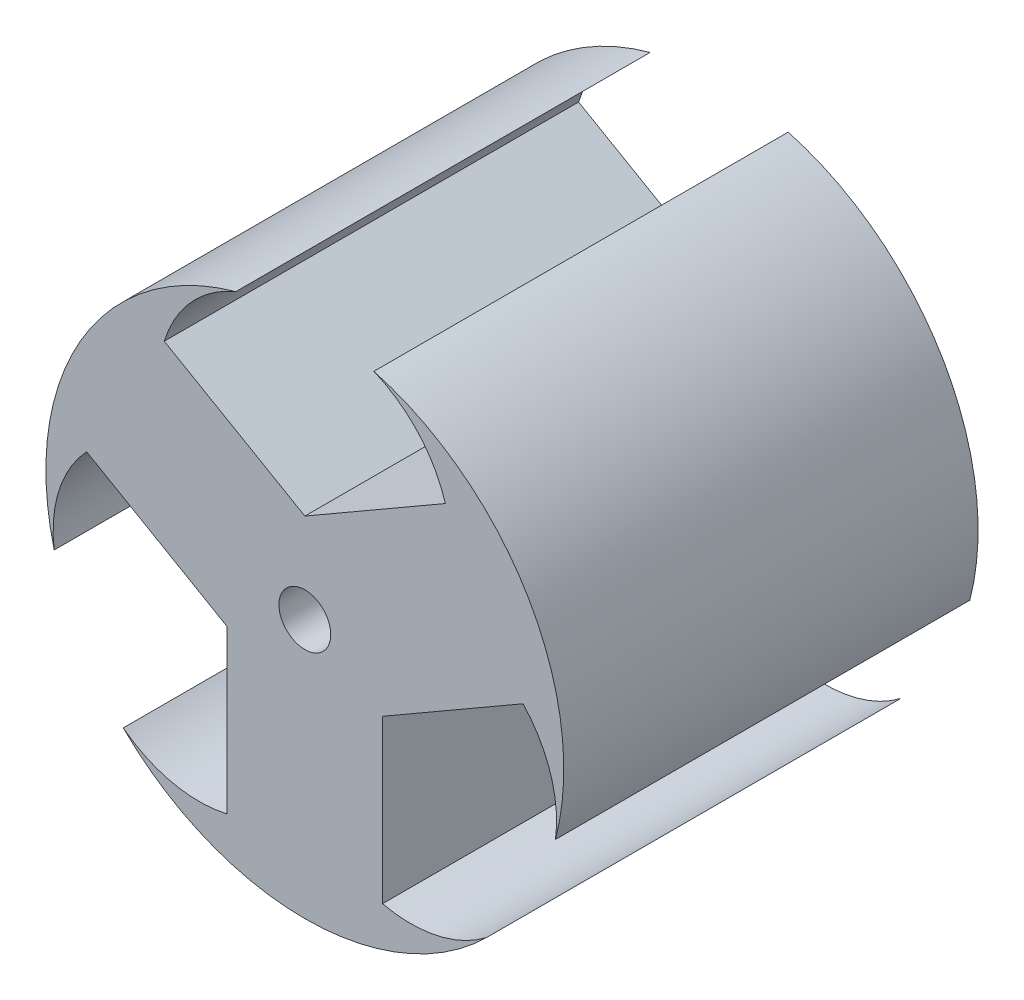
ISO-10303-21;
HEADER;
FILE_DESCRIPTION(('STEP AP214'),'2;1');
FILE_NAME('part.step','',(''),(''),'','','');
FILE_SCHEMA(('AUTOMOTIVE_DESIGN { 1 0 10303 214 1 1 1 1 }'));
ENDSEC;
DATA;
#1=APPLICATION_CONTEXT('core data for automotive mechanical design processes');
#2=APPLICATION_PROTOCOL_DEFINITION('international standard','automotive_design',2000,#1);
#3=PRODUCT_CONTEXT('',#1,'mechanical');
#4=PRODUCT('Part','Part','',(#3));
#5=PRODUCT_RELATED_PRODUCT_CATEGORY('part','',(#4));
#6=PRODUCT_DEFINITION_FORMATION('','',#4);
#7=PRODUCT_DEFINITION_CONTEXT('part definition',#1,'design');
#8=PRODUCT_DEFINITION('design','',#6,#7);
#9=PRODUCT_DEFINITION_SHAPE('','',#8);
#10=(LENGTH_UNIT() NAMED_UNIT(*) SI_UNIT(.MILLI.,.METRE.));
#11=(NAMED_UNIT(*) PLANE_ANGLE_UNIT() SI_UNIT($,.RADIAN.));
#12=(NAMED_UNIT(*) SI_UNIT($,.STERADIAN.) SOLID_ANGLE_UNIT());
#13=UNCERTAINTY_MEASURE_WITH_UNIT(LENGTH_MEASURE(1.E-05),#10,'distance_accuracy_value','');
#14=(GEOMETRIC_REPRESENTATION_CONTEXT(3) GLOBAL_UNCERTAINTY_ASSIGNED_CONTEXT((#13)) GLOBAL_UNIT_ASSIGNED_CONTEXT((#10,
#11,#12)) REPRESENTATION_CONTEXT('',''));
#15=CARTESIAN_POINT('',(0.,0.,0.));
#16=DIRECTION('',(0.,0.,1.));
#17=DIRECTION('',(1.,0.,0.));
#18=AXIS2_PLACEMENT_3D('',#15,#16,#17);
#19=CARTESIAN_POINT('',(-3.74999999999994,6.49519052838333,40.));
#20=DIRECTION('',(-0.499999999999992,0.866025403784443,0.));
#21=DIRECTION('',(-0.866025403784443,-0.499999999999992,0.));
#22=AXIS2_PLACEMENT_3D('',#19,#20,#21);
#23=PLANE('',#22);
#24=DIRECTION('',(0.866025403784443,0.499999999999992,0.));
#25=VECTOR('',#24,1.);
#26=CARTESIAN_POINT('',(-3.74999999999994,6.49519052838333,0.));
#27=LINE('',#26,#25);
#28=CARTESIAN_POINT('',(0.,8.66025403784438,0.));
#29=VERTEX_POINT('',#28);
#30=CARTESIAN_POINT('',(13.5705080756889,16.4951905283832,0.));
#31=VERTEX_POINT('',#30);
#32=EDGE_CURVE('E186',#29,#31,#27,.T.);
#33=ORIENTED_EDGE('',*,*,#32,.F.);
#34=DIRECTION('',(0.,0.,-1.));
#35=VECTOR('',#34,1.);
#36=CARTESIAN_POINT('',(0.,8.66025403784438,40.));
#37=LINE('',#36,#35);
#38=CARTESIAN_POINT('',(0.,8.66025403784438,40.));
#39=VERTEX_POINT('',#38);
#40=EDGE_CURVE('E11',#39,#29,#37,.T.);
#41=ORIENTED_EDGE('',*,*,#40,.F.);
#42=DIRECTION('',(0.866025403784443,0.499999999999992,0.));
#43=VECTOR('',#42,1.);
#44=CARTESIAN_POINT('',(-3.74999999999994,6.49519052838333,40.));
#45=LINE('',#44,#43);
#46=CARTESIAN_POINT('',(13.5705080756889,16.4951905283832,40.));
#47=VERTEX_POINT('',#46);
#48=EDGE_CURVE('E241',#39,#47,#45,.T.);
#49=ORIENTED_EDGE('',*,*,#48,.T.);
#50=DIRECTION('',(0.,0.,-1.));
#51=VECTOR('',#50,1.);
#52=CARTESIAN_POINT('',(13.5705080756889,16.4951905283832,40.));
#53=LINE('',#52,#51);
#54=EDGE_CURVE('E56',#47,#31,#53,.T.);
#55=ORIENTED_EDGE('',*,*,#54,.T.);
#56=EDGE_LOOP('',(#33,#41,#49,#55));
#57=FACE_BOUND('',#56,.T.);
#58=ADVANCED_FACE('F39',(#57),#23,.T.);
#59=CARTESIAN_POINT('',(3.75000000000003,6.49519052838327,40.));
#60=DIRECTION('',(-0.500000000000004,-0.866025403784436,0.));
#61=DIRECTION('',(0.866025403784436,-0.500000000000004,0.));
#62=AXIS2_PLACEMENT_3D('',#59,#60,#61);
#63=PLANE('',#62);
#64=DIRECTION('',(-0.866025403784436,0.500000000000004,0.));
#65=VECTOR('',#64,1.);
#66=CARTESIAN_POINT('',(3.75000000000003,6.49519052838327,0.));
#67=LINE('',#66,#65);
#68=CARTESIAN_POINT('',(-13.5705080756887,16.4951905283834,0.));
#69=VERTEX_POINT('',#68);
#70=EDGE_CURVE('E189',#29,#69,#67,.T.);
#71=ORIENTED_EDGE('',*,*,#70,.T.);
#72=DIRECTION('',(0.,0.,-1.));
#73=VECTOR('',#72,1.);
#74=CARTESIAN_POINT('',(-13.5705080756887,16.4951905283834,40.));
#75=LINE('',#74,#73);
#76=CARTESIAN_POINT('',(-13.5705080756887,16.4951905283834,40.));
#77=VERTEX_POINT('',#76);
#78=EDGE_CURVE('E48',#77,#69,#75,.T.);
#79=ORIENTED_EDGE('',*,*,#78,.F.);
#80=DIRECTION('',(-0.866025403784436,0.500000000000004,0.));
#81=VECTOR('',#80,1.);
#82=CARTESIAN_POINT('',(3.75000000000003,6.49519052838327,40.));
#83=LINE('',#82,#81);
#84=EDGE_CURVE('E307',#39,#77,#83,.T.);
#85=ORIENTED_EDGE('',*,*,#84,.F.);
#86=ORIENTED_EDGE('',*,*,#40,.T.);
#87=EDGE_LOOP('',(#71,#79,#85,#86));
#88=FACE_BOUND('',#87,.T.);
#89=ADVANCED_FACE('F353',(#88),#63,.F.);
#90=CARTESIAN_POINT('',(-2.05618261846129,12.9699639231802,40.));
#91=DIRECTION('',(0.,0.,-1.));
#92=DIRECTION('',(-1.,0.,0.));
#93=AXIS2_PLACEMENT_3D('',#90,#91,#92);
#94=CYLINDRICAL_SURFACE('',#93,12.0418816367288);
#95=CARTESIAN_POINT('',(-2.05618261846129,12.9699639231802,0.));
#96=DIRECTION('',(0.,0.,1.));
#97=DIRECTION('',(1.,0.,0.));
#98=AXIS2_PLACEMENT_3D('',#95,#96,#97);
#99=CIRCLE('',#98,12.0418816367288);
#100=CARTESIAN_POINT('',(-6.66344806589419,24.0956108009972,0.));
#101=VERTEX_POINT('',#100);
#102=EDGE_CURVE('E192',#69,#101,#99,.F.);
#103=ORIENTED_EDGE('',*,*,#102,.T.);
#104=DIRECTION('',(0.,0.,-1.));
#105=VECTOR('',#104,1.);
#106=CARTESIAN_POINT('',(-6.66344806589419,24.0956108009972,40.));
#107=LINE('',#106,#105);
#108=CARTESIAN_POINT('',(-6.66344806589419,24.0956108009972,40.));
#109=VERTEX_POINT('',#108);
#110=EDGE_CURVE('E274',#109,#101,#107,.T.);
#111=ORIENTED_EDGE('',*,*,#110,.F.);
#112=CARTESIAN_POINT('',(-2.05618261846129,12.9699639231802,40.));
#113=DIRECTION('',(0.,0.,1.));
#114=DIRECTION('',(1.,0.,0.));
#115=AXIS2_PLACEMENT_3D('',#112,#113,#114);
#116=CIRCLE('',#115,12.0418816367288);
#117=EDGE_CURVE('E285',#77,#109,#116,.F.);
#118=ORIENTED_EDGE('',*,*,#117,.F.);
#119=ORIENTED_EDGE('',*,*,#78,.T.);
#120=EDGE_LOOP('',(#103,#111,#118,#119));
#121=FACE_BOUND('',#120,.T.);
#122=ADVANCED_FACE('F283',(#121),#94,.F.);
#123=CARTESIAN_POINT('',(0.,0.,40.));
#124=DIRECTION('',(0.,0.,-1.));
#125=DIRECTION('',(-1.,0.,0.));
#126=AXIS2_PLACEMENT_3D('',#123,#124,#125);
#127=CYLINDRICAL_SURFACE('',#126,25.);
#128=CARTESIAN_POINT('',(0.,0.,0.));
#129=DIRECTION('',(0.,0.,1.));
#130=DIRECTION('',(1.,0.,0.));
#131=AXIS2_PLACEMENT_3D('',#128,#129,#130);
#132=CIRCLE('',#131,25.);
#133=CARTESIAN_POINT('',(-24.1991351063134,-6.27709009863569,0.));
#134=VERTEX_POINT('',#133);
#135=EDGE_CURVE('E195',#101,#134,#132,.T.);
#136=ORIENTED_EDGE('',*,*,#135,.T.);
#137=DIRECTION('',(0.,0.,-1.));
#138=VECTOR('',#137,1.);
#139=CARTESIAN_POINT('',(-24.1991351063134,-6.27709009863569,40.));
#140=LINE('',#139,#138);
#141=CARTESIAN_POINT('',(-24.1991351063134,-6.27709009863569,40.));
#142=VERTEX_POINT('',#141);
#143=EDGE_CURVE('E271',#142,#134,#140,.T.);
#144=ORIENTED_EDGE('',*,*,#143,.F.);
#145=CARTESIAN_POINT('',(0.,0.,40.));
#146=DIRECTION('',(0.,0.,1.));
#147=DIRECTION('',(1.,0.,0.));
#148=AXIS2_PLACEMENT_3D('',#145,#146,#147);
#149=CIRCLE('',#148,25.);
#150=EDGE_CURVE('E298',#109,#142,#149,.T.);
#151=ORIENTED_EDGE('',*,*,#150,.F.);
#152=ORIENTED_EDGE('',*,*,#110,.T.);
#153=EDGE_LOOP('',(#136,#144,#151,#152));
#154=FACE_BOUND('',#153,.T.);
#155=ADVANCED_FACE('F295',(#154),#127,.T.);
#156=CARTESIAN_POINT('',(-12.2604095528724,-4.7042755791825,40.));
#157=DIRECTION('',(0.,0.,-1.));
#158=DIRECTION('',(-1.,0.,0.));
#159=AXIS2_PLACEMENT_3D('',#156,#157,#158);
#160=CYLINDRICAL_SURFACE('',#159,12.0418816367288);
#161=CARTESIAN_POINT('',(-12.2604095528724,-4.7042755791825,0.));
#162=DIRECTION('',(0.,0.,1.));
#163=DIRECTION('',(1.,0.,0.));
#164=AXIS2_PLACEMENT_3D('',#161,#162,#163);
#165=CIRCLE('',#164,12.0418816367288);
#166=CARTESIAN_POINT('',(-21.0705080756888,3.50480947161681,0.));
#167=VERTEX_POINT('',#166);
#168=EDGE_CURVE('E199',#167,#134,#165,.T.);
#169=ORIENTED_EDGE('',*,*,#168,.F.);
#170=DIRECTION('',(0.,0.,-1.));
#171=VECTOR('',#170,1.);
#172=CARTESIAN_POINT('',(-21.0705080756888,3.50480947161681,40.));
#173=LINE('',#172,#171);
#174=CARTESIAN_POINT('',(-21.0705080756888,3.50480947161681,40.));
#175=VERTEX_POINT('',#174);
#176=EDGE_CURVE('E268',#175,#167,#173,.T.);
#177=ORIENTED_EDGE('',*,*,#176,.F.);
#178=CARTESIAN_POINT('',(-12.2604095528724,-4.7042755791825,40.));
#179=DIRECTION('',(0.,0.,1.));
#180=DIRECTION('',(1.,0.,0.));
#181=AXIS2_PLACEMENT_3D('',#178,#179,#180);
#182=CIRCLE('',#181,12.0418816367288);
#183=EDGE_CURVE('E301',#175,#142,#182,.T.);
#184=ORIENTED_EDGE('',*,*,#183,.T.);
#185=ORIENTED_EDGE('',*,*,#143,.T.);
#186=EDGE_LOOP('',(#169,#177,#184,#185));
#187=FACE_BOUND('',#186,.T.);
#188=ADVANCED_FACE('F472',(#187),#160,.F.);
#189=CARTESIAN_POINT('',(-3.75000000000003,-6.49519052838328,40.));
#190=DIRECTION('',(-0.500000000000004,-0.866025403784436,0.));
#191=DIRECTION('',(0.866025403784436,-0.500000000000004,0.));
#192=AXIS2_PLACEMENT_3D('',#189,#190,#191);
#193=PLANE('',#192);
#194=DIRECTION('',(-0.866025403784436,0.500000000000004,0.));
#195=VECTOR('',#194,1.);
#196=CARTESIAN_POINT('',(-3.75000000000003,-6.49519052838328,0.));
#197=LINE('',#196,#195);
#198=CARTESIAN_POINT('',(-7.5,-4.33012701892217,0.));
#199=VERTEX_POINT('',#198);
#200=EDGE_CURVE('E203',#199,#167,#197,.T.);
#201=ORIENTED_EDGE('',*,*,#200,.F.);
#202=DIRECTION('',(0.,0.,-1.));
#203=VECTOR('',#202,1.);
#204=CARTESIAN_POINT('',(-7.5,-4.33012701892217,40.));
#205=LINE('',#204,#203);
#206=CARTESIAN_POINT('',(-7.5,-4.33012701892217,40.));
#207=VERTEX_POINT('',#206);
#208=EDGE_CURVE('E265',#207,#199,#205,.T.);
#209=ORIENTED_EDGE('',*,*,#208,.F.);
#210=DIRECTION('',(-0.866025403784436,0.500000000000004,0.));
#211=VECTOR('',#210,1.);
#212=CARTESIAN_POINT('',(-3.75000000000003,-6.49519052838328,40.));
#213=LINE('',#212,#211);
#214=EDGE_CURVE('E305',#207,#175,#213,.T.);
#215=ORIENTED_EDGE('',*,*,#214,.T.);
#216=ORIENTED_EDGE('',*,*,#176,.T.);
#217=EDGE_LOOP('',(#201,#209,#215,#216));
#218=FACE_BOUND('',#217,.T.);
#219=ADVANCED_FACE('F463',(#218),#193,.T.);
#220=CARTESIAN_POINT('',(-7.5,0.,40.));
#221=DIRECTION('',(1.,0.,0.));
#222=DIRECTION('',(0.,0.,-1.));
#223=AXIS2_PLACEMENT_3D('',#220,#221,#222);
#224=PLANE('',#223);
#225=DIRECTION('',(0.,-1.,0.));
#226=VECTOR('',#225,1.);
#227=CARTESIAN_POINT('',(-7.5,0.,0.));
#228=LINE('',#227,#226);
#229=CARTESIAN_POINT('',(-7.5,-20.,0.));
#230=VERTEX_POINT('',#229);
#231=EDGE_CURVE('E207',#199,#230,#228,.T.);
#232=ORIENTED_EDGE('',*,*,#231,.T.);
#233=DIRECTION('',(0.,0.,-1.));
#234=VECTOR('',#233,1.);
#235=CARTESIAN_POINT('',(-7.5,-20.,40.));
#236=LINE('',#235,#234);
#237=CARTESIAN_POINT('',(-7.5,-20.,40.));
#238=VERTEX_POINT('',#237);
#239=EDGE_CURVE('E261',#238,#230,#236,.T.);
#240=ORIENTED_EDGE('',*,*,#239,.F.);
#241=DIRECTION('',(0.,-1.,0.));
#242=VECTOR('',#241,1.);
#243=CARTESIAN_POINT('',(-7.5,0.,40.));
#244=LINE('',#243,#242);
#245=EDGE_CURVE('E314',#207,#238,#244,.T.);
#246=ORIENTED_EDGE('',*,*,#245,.F.);
#247=ORIENTED_EDGE('',*,*,#208,.T.);
#248=EDGE_LOOP('',(#232,#240,#246,#247));
#249=FACE_BOUND('',#248,.T.);
#250=ADVANCED_FACE('F454',(#249),#224,.F.);
#251=CARTESIAN_POINT('',(-10.2042269344111,-8.26568834399764,40.));
#252=DIRECTION('',(0.,0.,-1.));
#253=DIRECTION('',(-1.,0.,0.));
#254=AXIS2_PLACEMENT_3D('',#251,#252,#253);
#255=CYLINDRICAL_SURFACE('',#254,12.0418816367288);
#256=CARTESIAN_POINT('',(-10.2042269344111,-8.26568834399764,0.));
#257=DIRECTION('',(0.,0.,1.));
#258=DIRECTION('',(1.,0.,0.));
#259=AXIS2_PLACEMENT_3D('',#256,#257,#258);
#260=CIRCLE('',#259,12.0418816367288);
#261=CARTESIAN_POINT('',(-17.5356870404191,-17.8185207023613,0.));
#262=VERTEX_POINT('',#261);
#263=EDGE_CURVE('E210',#230,#262,#260,.F.);
#264=ORIENTED_EDGE('',*,*,#263,.T.);
#265=DIRECTION('',(0.,0.,-1.));
#266=VECTOR('',#265,1.);
#267=CARTESIAN_POINT('',(-17.5356870404191,-17.8185207023613,40.));
#268=LINE('',#267,#266);
#269=CARTESIAN_POINT('',(-17.5356870404191,-17.8185207023613,40.));
#270=VERTEX_POINT('',#269);
#271=EDGE_CURVE('E257',#270,#262,#268,.T.);
#272=ORIENTED_EDGE('',*,*,#271,.F.);
#273=CARTESIAN_POINT('',(-10.2042269344111,-8.26568834399764,40.));
#274=DIRECTION('',(0.,0.,1.));
#275=DIRECTION('',(1.,0.,0.));
#276=AXIS2_PLACEMENT_3D('',#273,#274,#275);
#277=CIRCLE('',#276,12.0418816367288);
#278=EDGE_CURVE('E317',#238,#270,#277,.F.);
#279=ORIENTED_EDGE('',*,*,#278,.F.);
#280=ORIENTED_EDGE('',*,*,#239,.T.);
#281=EDGE_LOOP('',(#264,#272,#279,#280));
#282=FACE_BOUND('',#281,.T.);
#283=ADVANCED_FACE('F445',(#282),#255,.F.);
#284=CARTESIAN_POINT('',(0.,0.,40.));
#285=DIRECTION('',(0.,0.,-1.));
#286=DIRECTION('',(-1.,0.,0.));
#287=AXIS2_PLACEMENT_3D('',#284,#285,#286);
#288=CYLINDRICAL_SURFACE('',#287,25.);
#289=CARTESIAN_POINT('',(0.,0.,0.));
#290=DIRECTION('',(0.,0.,1.));
#291=DIRECTION('',(1.,0.,0.));
#292=AXIS2_PLACEMENT_3D('',#289,#290,#291);
#293=CIRCLE('',#292,25.);
#294=CARTESIAN_POINT('',(17.5356870404191,-17.8185207023613,0.));
#295=VERTEX_POINT('',#294);
#296=EDGE_CURVE('E213',#262,#295,#293,.T.);
#297=ORIENTED_EDGE('',*,*,#296,.T.);
#298=DIRECTION('',(0.,0.,-1.));
#299=VECTOR('',#298,1.);
#300=CARTESIAN_POINT('',(17.5356870404191,-17.8185207023613,40.));
#301=LINE('',#300,#299);
#302=CARTESIAN_POINT('',(17.5356870404191,-17.8185207023613,40.));
#303=VERTEX_POINT('',#302);
#304=EDGE_CURVE('E254',#303,#295,#301,.T.);
#305=ORIENTED_EDGE('',*,*,#304,.F.);
#306=CARTESIAN_POINT('',(0.,0.,40.));
#307=DIRECTION('',(0.,0.,1.));
#308=DIRECTION('',(1.,0.,0.));
#309=AXIS2_PLACEMENT_3D('',#306,#307,#308);
#310=CIRCLE('',#309,25.);
#311=EDGE_CURVE('E320',#270,#303,#310,.T.);
#312=ORIENTED_EDGE('',*,*,#311,.F.);
#313=ORIENTED_EDGE('',*,*,#271,.T.);
#314=EDGE_LOOP('',(#297,#305,#312,#313));
#315=FACE_BOUND('',#314,.T.);
#316=ADVANCED_FACE('F437',(#315),#288,.T.);
#317=CARTESIAN_POINT('',(10.2042269344111,-8.26568834399764,40.));
#318=DIRECTION('',(0.,0.,-1.));
#319=DIRECTION('',(-1.,0.,0.));
#320=AXIS2_PLACEMENT_3D('',#317,#318,#319);
#321=CYLINDRICAL_SURFACE('',#320,12.0418816367288);
#322=CARTESIAN_POINT('',(10.2042269344111,-8.26568834399764,0.));
#323=DIRECTION('',(0.,0.,1.));
#324=DIRECTION('',(1.,0.,0.));
#325=AXIS2_PLACEMENT_3D('',#322,#323,#324);
#326=CIRCLE('',#325,12.0418816367288);
#327=CARTESIAN_POINT('',(7.5,-20.,0.));
#328=VERTEX_POINT('',#327);
#329=EDGE_CURVE('E217',#328,#295,#326,.T.);
#330=ORIENTED_EDGE('',*,*,#329,.F.);
#331=DIRECTION('',(0.,0.,-1.));
#332=VECTOR('',#331,1.);
#333=CARTESIAN_POINT('',(7.5,-20.,40.));
#334=LINE('',#333,#332);
#335=CARTESIAN_POINT('',(7.5,-20.,40.));
#336=VERTEX_POINT('',#335);
#337=EDGE_CURVE('E251',#336,#328,#334,.T.);
#338=ORIENTED_EDGE('',*,*,#337,.F.);
#339=CARTESIAN_POINT('',(10.2042269344111,-8.26568834399764,40.));
#340=DIRECTION('',(0.,0.,1.));
#341=DIRECTION('',(1.,0.,0.));
#342=AXIS2_PLACEMENT_3D('',#339,#340,#341);
#343=CIRCLE('',#342,12.0418816367288);
#344=EDGE_CURVE('E323',#336,#303,#343,.T.);
#345=ORIENTED_EDGE('',*,*,#344,.T.);
#346=ORIENTED_EDGE('',*,*,#304,.T.);
#347=EDGE_LOOP('',(#330,#338,#345,#346));
#348=FACE_BOUND('',#347,.T.);
#349=ADVANCED_FACE('F339',(#348),#321,.F.);
#350=CARTESIAN_POINT('',(7.5,0.,40.));
#351=DIRECTION('',(1.,0.,0.));
#352=DIRECTION('',(0.,0.,-1.));
#353=AXIS2_PLACEMENT_3D('',#350,#351,#352);
#354=PLANE('',#353);
#355=DIRECTION('',(0.,-1.,0.));
#356=VECTOR('',#355,1.);
#357=CARTESIAN_POINT('',(7.5,0.,0.));
#358=LINE('',#357,#356);
#359=CARTESIAN_POINT('',(7.5,-4.33012701892223,0.));
#360=VERTEX_POINT('',#359);
#361=EDGE_CURVE('E221',#360,#328,#358,.T.);
#362=ORIENTED_EDGE('',*,*,#361,.F.);
#363=DIRECTION('',(0.,0.,-1.));
#364=VECTOR('',#363,1.);
#365=CARTESIAN_POINT('',(7.5,-4.33012701892223,40.));
#366=LINE('',#365,#364);
#367=CARTESIAN_POINT('',(7.5,-4.33012701892223,40.));
#368=VERTEX_POINT('',#367);
#369=EDGE_CURVE('E248',#368,#360,#366,.T.);
#370=ORIENTED_EDGE('',*,*,#369,.F.);
#371=DIRECTION('',(0.,-1.,0.));
#372=VECTOR('',#371,1.);
#373=CARTESIAN_POINT('',(7.5,0.,40.));
#374=LINE('',#373,#372);
#375=EDGE_CURVE('E327',#368,#336,#374,.T.);
#376=ORIENTED_EDGE('',*,*,#375,.T.);
#377=ORIENTED_EDGE('',*,*,#337,.T.);
#378=EDGE_LOOP('',(#362,#370,#376,#377));
#379=FACE_BOUND('',#378,.T.);
#380=ADVANCED_FACE('F333',(#379),#354,.T.);
#381=CARTESIAN_POINT('',(3.74999999999994,-6.49519052838332,40.));
#382=DIRECTION('',(-0.499999999999992,0.866025403784443,0.));
#383=DIRECTION('',(-0.866025403784443,-0.499999999999992,0.));
#384=AXIS2_PLACEMENT_3D('',#381,#382,#383);
#385=PLANE('',#384);
#386=DIRECTION('',(0.866025403784443,0.499999999999992,0.));
#387=VECTOR('',#386,1.);
#388=CARTESIAN_POINT('',(3.74999999999994,-6.49519052838332,0.));
#389=LINE('',#388,#387);
#390=CARTESIAN_POINT('',(21.0705080756888,3.50480947161652,0.));
#391=VERTEX_POINT('',#390);
#392=EDGE_CURVE('E225',#360,#391,#389,.T.);
#393=ORIENTED_EDGE('',*,*,#392,.T.);
#394=DIRECTION('',(0.,0.,-1.));
#395=VECTOR('',#394,1.);
#396=CARTESIAN_POINT('',(21.0705080756888,3.50480947161652,40.));
#397=LINE('',#396,#395);
#398=CARTESIAN_POINT('',(21.0705080756888,3.50480947161652,40.));
#399=VERTEX_POINT('',#398);
#400=EDGE_CURVE('E172',#399,#391,#397,.T.);
#401=ORIENTED_EDGE('',*,*,#400,.F.);
#402=DIRECTION('',(0.866025403784443,0.499999999999992,0.));
#403=VECTOR('',#402,1.);
#404=CARTESIAN_POINT('',(3.74999999999994,-6.49519052838332,40.));
#405=LINE('',#404,#403);
#406=EDGE_CURVE('E158',#368,#399,#405,.T.);
#407=ORIENTED_EDGE('',*,*,#406,.F.);
#408=ORIENTED_EDGE('',*,*,#369,.T.);
#409=EDGE_LOOP('',(#393,#401,#407,#408));
#410=FACE_BOUND('',#409,.T.);
#411=ADVANCED_FACE('F343',(#410),#385,.F.);
#412=CARTESIAN_POINT('',(12.2604095528724,-4.70427557918267,40.));
#413=DIRECTION('',(0.,0.,-1.));
#414=DIRECTION('',(-1.,0.,0.));
#415=AXIS2_PLACEMENT_3D('',#412,#413,#414);
#416=CYLINDRICAL_SURFACE('',#415,12.0418816367288);
#417=CARTESIAN_POINT('',(12.2604095528724,-4.70427557918267,0.));
#418=DIRECTION('',(0.,0.,1.));
#419=DIRECTION('',(1.,0.,0.));
#420=AXIS2_PLACEMENT_3D('',#417,#418,#419);
#421=CIRCLE('',#420,12.0418816367288);
#422=CARTESIAN_POINT('',(24.1991351063133,-6.27709009863603,0.));
#423=VERTEX_POINT('',#422);
#424=EDGE_CURVE('E168',#391,#423,#421,.F.);
#425=ORIENTED_EDGE('',*,*,#424,.T.);
#426=DIRECTION('',(0.,0.,-1.));
#427=VECTOR('',#426,1.);
#428=CARTESIAN_POINT('',(24.1991351063133,-6.27709009863603,40.));
#429=LINE('',#428,#427);
#430=CARTESIAN_POINT('',(24.1991351063133,-6.27709009863603,40.));
#431=VERTEX_POINT('',#430);
#432=EDGE_CURVE('E165',#431,#423,#429,.T.);
#433=ORIENTED_EDGE('',*,*,#432,.F.);
#434=CARTESIAN_POINT('',(12.2604095528724,-4.70427557918267,40.));
#435=DIRECTION('',(0.,0.,1.));
#436=DIRECTION('',(1.,0.,0.));
#437=AXIS2_PLACEMENT_3D('',#434,#435,#436);
#438=CIRCLE('',#437,12.0418816367288);
#439=EDGE_CURVE('E148',#399,#431,#438,.F.);
#440=ORIENTED_EDGE('',*,*,#439,.F.);
#441=ORIENTED_EDGE('',*,*,#400,.T.);
#442=EDGE_LOOP('',(#425,#433,#440,#441));
#443=FACE_BOUND('',#442,.T.);
#444=ADVANCED_FACE('F166',(#443),#416,.F.);
#445=CARTESIAN_POINT('',(0.,0.,40.));
#446=DIRECTION('',(0.,0.,-1.));
#447=DIRECTION('',(-1.,0.,0.));
#448=AXIS2_PLACEMENT_3D('',#445,#446,#447);
#449=CYLINDRICAL_SURFACE('',#448,25.);
#450=CARTESIAN_POINT('',(0.,0.,0.));
#451=DIRECTION('',(0.,0.,1.));
#452=DIRECTION('',(1.,0.,0.));
#453=AXIS2_PLACEMENT_3D('',#450,#451,#452);
#454=CIRCLE('',#453,25.);
#455=CARTESIAN_POINT('',(6.66344806589453,24.0956108009971,0.));
#456=VERTEX_POINT('',#455);
#457=EDGE_CURVE('E230',#423,#456,#454,.T.);
#458=ORIENTED_EDGE('',*,*,#457,.T.);
#459=DIRECTION('',(0.,0.,-1.));
#460=VECTOR('',#459,1.);
#461=CARTESIAN_POINT('',(6.66344806589453,24.0956108009971,40.));
#462=LINE('',#461,#460);
#463=CARTESIAN_POINT('',(6.66344806589453,24.0956108009971,40.));
#464=VERTEX_POINT('',#463);
#465=EDGE_CURVE('E103',#464,#456,#462,.T.);
#466=ORIENTED_EDGE('',*,*,#465,.F.);
#467=CARTESIAN_POINT('',(0.,0.,40.));
#468=DIRECTION('',(0.,0.,1.));
#469=DIRECTION('',(1.,0.,0.));
#470=AXIS2_PLACEMENT_3D('',#467,#468,#469);
#471=CIRCLE('',#470,25.);
#472=EDGE_CURVE('E155',#431,#464,#471,.T.);
#473=ORIENTED_EDGE('',*,*,#472,.F.);
#474=ORIENTED_EDGE('',*,*,#432,.T.);
#475=EDGE_LOOP('',(#458,#466,#473,#474));
#476=FACE_BOUND('',#475,.T.);
#477=ADVANCED_FACE('F174',(#476),#449,.T.);
#478=CARTESIAN_POINT('',(2.05618261846147,12.9699639231802,40.));
#479=DIRECTION('',(0.,0.,-1.));
#480=DIRECTION('',(-1.,0.,0.));
#481=AXIS2_PLACEMENT_3D('',#478,#479,#480);
#482=CYLINDRICAL_SURFACE('',#481,12.0418816367288);
#483=CARTESIAN_POINT('',(2.05618261846147,12.9699639231802,0.));
#484=DIRECTION('',(0.,0.,1.));
#485=DIRECTION('',(1.,0.,0.));
#486=AXIS2_PLACEMENT_3D('',#483,#484,#485);
#487=CIRCLE('',#486,12.0418816367288);
#488=EDGE_CURVE('E233',#31,#456,#487,.T.);
#489=ORIENTED_EDGE('',*,*,#488,.F.);
#490=ORIENTED_EDGE('',*,*,#54,.F.);
#491=CARTESIAN_POINT('',(2.05618261846147,12.9699639231802,40.));
#492=DIRECTION('',(0.,0.,1.));
#493=DIRECTION('',(1.,0.,0.));
#494=AXIS2_PLACEMENT_3D('',#491,#492,#493);
#495=CIRCLE('',#494,12.0418816367288);
#496=EDGE_CURVE('E176',#47,#464,#495,.T.);
#497=ORIENTED_EDGE('',*,*,#496,.T.);
#498=ORIENTED_EDGE('',*,*,#465,.T.);
#499=EDGE_LOOP('',(#489,#490,#497,#498));
#500=FACE_BOUND('',#499,.T.);
#501=ADVANCED_FACE('F357',(#500),#482,.F.);
#502=CARTESIAN_POINT('',(0.,0.,40.));
#503=DIRECTION('',(0.,0.,-1.));
#504=DIRECTION('',(-1.,0.,0.));
#505=AXIS2_PLACEMENT_3D('',#502,#503,#504);
#506=CYLINDRICAL_SURFACE('',#505,2.5);
#507=CARTESIAN_POINT('',(0.,0.,40.));
#508=DIRECTION('',(0.,0.,1.));
#509=DIRECTION('',(1.,0.,0.));
#510=AXIS2_PLACEMENT_3D('',#507,#508,#509);
#511=CIRCLE('',#510,2.5);
#512=CARTESIAN_POINT('',(2.5,0.,40.));
#513=VERTEX_POINT('',#512);
#514=EDGE_CURVE('E179',#513,#513,#511,.T.);
#515=ORIENTED_EDGE('',*,*,#514,.T.);
#516=EDGE_LOOP('',(#515));
#517=FACE_BOUND('',#516,.T.);
#518=CARTESIAN_POINT('',(0.,0.,0.));
#519=DIRECTION('',(0.,0.,1.));
#520=DIRECTION('',(1.,0.,0.));
#521=AXIS2_PLACEMENT_3D('',#518,#519,#520);
#522=CIRCLE('',#521,2.5);
#523=CARTESIAN_POINT('',(2.5,0.,0.));
#524=VERTEX_POINT('',#523);
#525=EDGE_CURVE('E237',#524,#524,#522,.T.);
#526=ORIENTED_EDGE('',*,*,#525,.F.);
#527=EDGE_LOOP('',(#526));
#528=FACE_BOUND('',#527,.T.);
#529=ADVANCED_FACE('F359',(#517,#528),#506,.F.);
#530=CARTESIAN_POINT('',(0.,0.,40.));
#531=DIRECTION('',(0.,0.,1.));
#532=DIRECTION('',(1.,0.,0.));
#533=AXIS2_PLACEMENT_3D('',#530,#531,#532);
#534=PLANE('',#533);
#535=ORIENTED_EDGE('',*,*,#48,.F.);
#536=ORIENTED_EDGE('',*,*,#84,.T.);
#537=ORIENTED_EDGE('',*,*,#117,.T.);
#538=ORIENTED_EDGE('',*,*,#150,.T.);
#539=ORIENTED_EDGE('',*,*,#183,.F.);
#540=ORIENTED_EDGE('',*,*,#214,.F.);
#541=ORIENTED_EDGE('',*,*,#245,.T.);
#542=ORIENTED_EDGE('',*,*,#278,.T.);
#543=ORIENTED_EDGE('',*,*,#311,.T.);
#544=ORIENTED_EDGE('',*,*,#344,.F.);
#545=ORIENTED_EDGE('',*,*,#375,.F.);
#546=ORIENTED_EDGE('',*,*,#406,.T.);
#547=ORIENTED_EDGE('',*,*,#439,.T.);
#548=ORIENTED_EDGE('',*,*,#472,.T.);
#549=ORIENTED_EDGE('',*,*,#496,.F.);
#550=EDGE_LOOP('',(#535,#536,#537,#538,#539,#540,#541,#542,#543,#544,#545,#546,#547,#548,#549));
#551=FACE_BOUND('',#550,.T.);
#552=ORIENTED_EDGE('',*,*,#514,.F.);
#553=EDGE_LOOP('',(#552));
#554=FACE_BOUND('',#553,.T.);
#555=ADVANCED_FACE('F151',(#551,#554),#534,.T.);
#556=CARTESIAN_POINT('',(0.,0.,0.));
#557=DIRECTION('',(0.,0.,1.));
#558=DIRECTION('',(1.,0.,0.));
#559=AXIS2_PLACEMENT_3D('',#556,#557,#558);
#560=PLANE('',#559);
#561=ORIENTED_EDGE('',*,*,#32,.T.);
#562=ORIENTED_EDGE('',*,*,#488,.T.);
#563=ORIENTED_EDGE('',*,*,#457,.F.);
#564=ORIENTED_EDGE('',*,*,#424,.F.);
#565=ORIENTED_EDGE('',*,*,#392,.F.);
#566=ORIENTED_EDGE('',*,*,#361,.T.);
#567=ORIENTED_EDGE('',*,*,#329,.T.);
#568=ORIENTED_EDGE('',*,*,#296,.F.);
#569=ORIENTED_EDGE('',*,*,#263,.F.);
#570=ORIENTED_EDGE('',*,*,#231,.F.);
#571=ORIENTED_EDGE('',*,*,#200,.T.);
#572=ORIENTED_EDGE('',*,*,#168,.T.);
#573=ORIENTED_EDGE('',*,*,#135,.F.);
#574=ORIENTED_EDGE('',*,*,#102,.F.);
#575=ORIENTED_EDGE('',*,*,#70,.F.);
#576=EDGE_LOOP('',(#561,#562,#563,#564,#565,#566,#567,#568,#569,#570,#571,#572,#573,#574,#575));
#577=FACE_BOUND('',#576,.T.);
#578=ORIENTED_EDGE('',*,*,#525,.T.);
#579=EDGE_LOOP('',(#578));
#580=FACE_BOUND('',#579,.T.);
#581=ADVANCED_FACE('F290',(#577,#580),#560,.F.);
#582=CLOSED_SHELL('',(#58,#89,#122,#155,#188,#219,#250,#283,#316,#349,#380,#411,#444,#477,#501,
#529,#555,#581));
#583=MANIFOLD_SOLID_BREP('B2',#582);
#584=ADVANCED_BREP_SHAPE_REPRESENTATION('',(#18,#583),#14);
#585=SHAPE_DEFINITION_REPRESENTATION(#9,#584);
ENDSEC;
END-ISO-10303-21;
